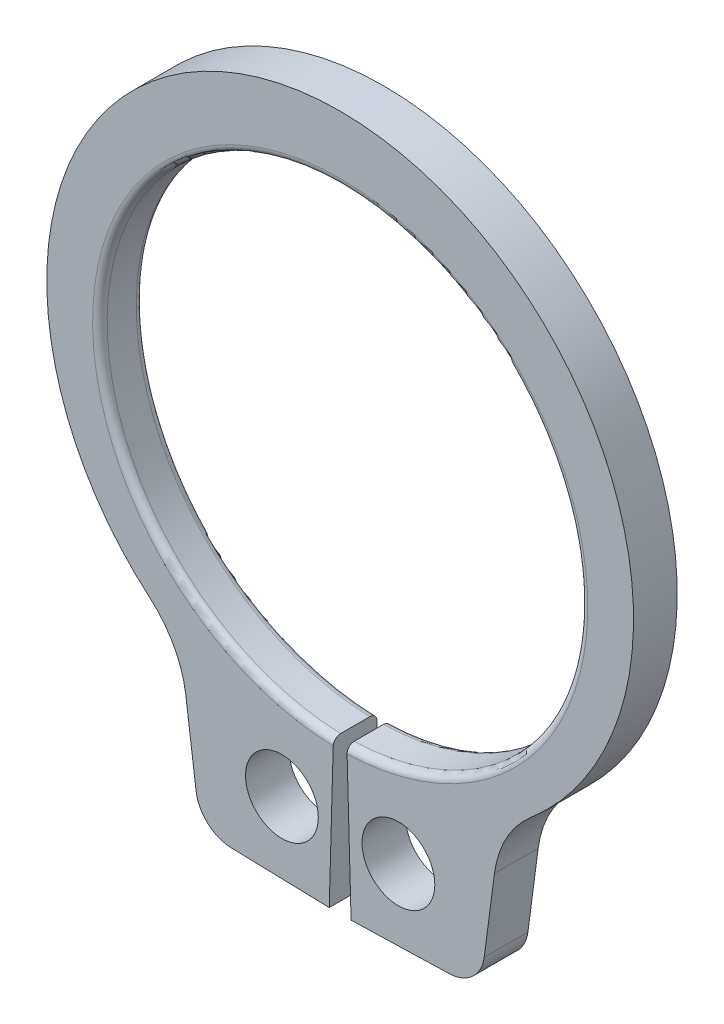
ISO-10303-21;
HEADER;
FILE_DESCRIPTION(('STEP AP214'),'2;1');
FILE_NAME('part.step','',(''),(''),'','','');
FILE_SCHEMA(('AUTOMOTIVE_DESIGN { 1 0 10303 214 1 1 1 1 }'));
ENDSEC;
DATA;
#1=APPLICATION_CONTEXT('core data for automotive mechanical design processes');
#2=APPLICATION_PROTOCOL_DEFINITION('international standard','automotive_design',2000,#1);
#3=PRODUCT_CONTEXT('',#1,'mechanical');
#4=PRODUCT('Part','Part','',(#3));
#5=PRODUCT_RELATED_PRODUCT_CATEGORY('part','',(#4));
#6=PRODUCT_DEFINITION_FORMATION('','',#4);
#7=PRODUCT_DEFINITION_CONTEXT('part definition',#1,'design');
#8=PRODUCT_DEFINITION('design','',#6,#7);
#9=PRODUCT_DEFINITION_SHAPE('','',#8);
#10=(LENGTH_UNIT() NAMED_UNIT(*) SI_UNIT(.MILLI.,.METRE.));
#11=(NAMED_UNIT(*) PLANE_ANGLE_UNIT() SI_UNIT($,.RADIAN.));
#12=(NAMED_UNIT(*) SI_UNIT($,.STERADIAN.) SOLID_ANGLE_UNIT());
#13=UNCERTAINTY_MEASURE_WITH_UNIT(LENGTH_MEASURE(1.E-05),#10,'distance_accuracy_value','');
#14=(GEOMETRIC_REPRESENTATION_CONTEXT(3) GLOBAL_UNCERTAINTY_ASSIGNED_CONTEXT((#13)) GLOBAL_UNIT_ASSIGNED_CONTEXT((#10,
#11,#12)) REPRESENTATION_CONTEXT('',''));
#15=CARTESIAN_POINT('',(0.,0.,0.));
#16=DIRECTION('',(0.,0.,1.));
#17=DIRECTION('',(1.,0.,0.));
#18=AXIS2_PLACEMENT_3D('',#15,#16,#17);
#19=CARTESIAN_POINT('',(-0.737282973034326,1.18870796081462,-0.413580684840872));
#20=DIRECTION('',(0.,0.,1.));
#21=DIRECTION('',(1.,0.,0.));
#22=AXIS2_PLACEMENT_3D('',#19,#20,#21);
#23=CYLINDRICAL_SURFACE('',#22,3.3);
#24=DIRECTION('',(0.,0.,1.));
#25=VECTOR('',#24,1.);
#26=CARTESIAN_POINT('',(-0.644759608548344,-2.10999472767129,-0.413580684840872));
#27=LINE('',#26,#25);
#28=CARTESIAN_POINT('',(-0.644759608548344,-2.10999472767129,-0.313580684840872));
#29=VERTEX_POINT('',#28);
#30=CARTESIAN_POINT('',(-0.644759608548344,-2.10999472767129,0.086419315159128));
#31=VERTEX_POINT('',#30);
#32=EDGE_CURVE('E161',#29,#31,#27,.T.);
#33=ORIENTED_EDGE('',*,*,#32,.T.);
#34=CARTESIAN_POINT('',(-0.737282973034326,1.18870796081462,0.086419315159128));
#35=DIRECTION('',(0.,0.,1.));
#36=DIRECTION('',(1.,0.,0.));
#37=AXIS2_PLACEMENT_3D('',#34,#35,#36);
#38=CIRCLE('',#37,3.3);
#39=CARTESIAN_POINT('',(-0.829806337520307,-2.10999472767129,0.086419315159128));
#40=VERTEX_POINT('',#39);
#41=EDGE_CURVE('E62',#31,#40,#38,.T.);
#42=ORIENTED_EDGE('',*,*,#41,.T.);
#43=DIRECTION('',(0.,0.,1.));
#44=VECTOR('',#43,1.);
#45=CARTESIAN_POINT('',(-0.829806337520307,-2.10999472767129,-0.413580684840872));
#46=LINE('',#45,#44);
#47=CARTESIAN_POINT('',(-0.829806337520307,-2.10999472767129,-0.313580684840872));
#48=VERTEX_POINT('',#47);
#49=EDGE_CURVE('E225',#48,#40,#46,.T.);
#50=ORIENTED_EDGE('',*,*,#49,.F.);
#51=CARTESIAN_POINT('',(-0.737282973034326,1.18870796081462,-0.313580684840872));
#52=DIRECTION('',(0.,0.,1.));
#53=DIRECTION('',(1.,0.,0.));
#54=AXIS2_PLACEMENT_3D('',#51,#52,#53);
#55=CIRCLE('',#54,3.3);
#56=EDGE_CURVE('E251',#48,#29,#55,.F.);
#57=ORIENTED_EDGE('',*,*,#56,.T.);
#58=EDGE_LOOP('',(#33,#42,#50,#57));
#59=FACE_BOUND('',#58,.T.);
#60=ADVANCED_FACE('F41',(#59),#23,.F.);
#61=CARTESIAN_POINT('',(-0.829806337520307,-2.10999472767129,-0.413580684840872));
#62=DIRECTION('',(0.999606875298762,-0.0280373831775701,0.));
#63=DIRECTION('',(0.0280373831775701,0.999606875298762,0.));
#64=AXIS2_PLACEMENT_3D('',#61,#62,#63);
#65=PLANE('',#64);
#66=ORIENTED_EDGE('',*,*,#49,.T.);
#67=CARTESIAN_POINT('',(-0.832610075838064,-2.20995541520117,0.086419315159128));
#68=DIRECTION('',(0.999606875298762,-0.0280373831775701,0.));
#69=DIRECTION('',(0.0280373831775701,0.999606875298762,0.));
#70=AXIS2_PLACEMENT_3D('',#67,#68,#69);
#71=CIRCLE('',#70,0.1);
#72=CARTESIAN_POINT('',(-0.832610075838064,-2.20995541520117,0.186419315159128));
#73=VERTEX_POINT('',#72);
#74=EDGE_CURVE('E49',#40,#73,#71,.T.);
#75=ORIENTED_EDGE('',*,*,#74,.T.);
#76=DIRECTION('',(0.0280373831775701,0.999606875298762,0.));
#77=VECTOR('',#76,1.);
#78=CARTESIAN_POINT('',(-0.829806337520307,-2.10999472767129,0.186419315159128));
#79=LINE('',#78,#77);
#80=CARTESIAN_POINT('',(-0.887282973034325,-4.15918882203375,0.186419315159128));
#81=VERTEX_POINT('',#80);
#82=EDGE_CURVE('E153',#81,#73,#79,.T.);
#83=ORIENTED_EDGE('',*,*,#82,.F.);
#84=DIRECTION('',(0.,0.,1.));
#85=VECTOR('',#84,1.);
#86=CARTESIAN_POINT('',(-0.887282973034325,-4.15918882203375,-0.413580684840872));
#87=LINE('',#86,#85);
#88=CARTESIAN_POINT('',(-0.887282973034325,-4.15918882203375,-0.413580684840872));
#89=VERTEX_POINT('',#88);
#90=EDGE_CURVE('E228',#89,#81,#87,.T.);
#91=ORIENTED_EDGE('',*,*,#90,.F.);
#92=DIRECTION('',(0.0280373831775701,0.999606875298762,0.));
#93=VECTOR('',#92,1.);
#94=CARTESIAN_POINT('',(-0.829806337520307,-2.10999472767129,-0.413580684840872));
#95=LINE('',#94,#93);
#96=CARTESIAN_POINT('',(-0.832610075838064,-2.20995541520117,-0.413580684840872));
#97=VERTEX_POINT('',#96);
#98=EDGE_CURVE('E193',#89,#97,#95,.T.);
#99=ORIENTED_EDGE('',*,*,#98,.T.);
#100=CARTESIAN_POINT('',(-0.832610075838064,-2.20995541520117,-0.313580684840872));
#101=DIRECTION('',(0.999606875298762,-0.0280373831775701,0.));
#102=DIRECTION('',(0.0280373831775701,0.999606875298762,0.));
#103=AXIS2_PLACEMENT_3D('',#100,#101,#102);
#104=CIRCLE('',#103,0.1);
#105=EDGE_CURVE('E255',#97,#48,#104,.T.);
#106=ORIENTED_EDGE('',*,*,#105,.T.);
#107=EDGE_LOOP('',(#66,#75,#83,#91,#99,#106));
#108=FACE_BOUND('',#107,.T.);
#109=ADVANCED_FACE('F259',(#108),#65,.T.);
#110=CARTESIAN_POINT('',(-0.887282973034325,-4.15918882203375,-0.413580684840872));
#111=DIRECTION('',(-0.0280373831775699,-0.999606875298762,0.));
#112=DIRECTION('',(0.999606875298762,-0.0280373831775699,0.));
#113=AXIS2_PLACEMENT_3D('',#110,#111,#112);
#114=PLANE('',#113);
#115=DIRECTION('',(0.999606875298762,-0.0280373831775699,0.));
#116=VECTOR('',#115,1.);
#117=CARTESIAN_POINT('',(-0.887282973034325,-4.15918882203375,0.186419315159128));
#118=LINE('',#117,#116);
#119=CARTESIAN_POINT('',(-2.23422534316447,-4.12140923059371,0.186419315159128));
#120=VERTEX_POINT('',#119);
#121=EDGE_CURVE('E220',#120,#81,#118,.T.);
#122=ORIENTED_EDGE('',*,*,#121,.F.);
#123=DIRECTION('',(0.,0.,1.));
#124=VECTOR('',#123,1.);
#125=CARTESIAN_POINT('',(-2.23422534316447,-4.12140923059371,-0.413580684840872));
#126=LINE('',#125,#124);
#127=CARTESIAN_POINT('',(-2.23422534316447,-4.12140923059371,-0.413580684840872));
#128=VERTEX_POINT('',#127);
#129=EDGE_CURVE('E230',#128,#120,#126,.T.);
#130=ORIENTED_EDGE('',*,*,#129,.F.);
#131=DIRECTION('',(0.999606875298762,-0.0280373831775699,0.));
#132=VECTOR('',#131,1.);
#133=CARTESIAN_POINT('',(-0.887282973034325,-4.15918882203375,-0.413580684840872));
#134=LINE('',#133,#132);
#135=EDGE_CURVE('E190',#128,#89,#134,.T.);
#136=ORIENTED_EDGE('',*,*,#135,.T.);
#137=ORIENTED_EDGE('',*,*,#90,.T.);
#138=EDGE_LOOP('',(#122,#130,#136,#137));
#139=FACE_BOUND('',#138,.T.);
#140=ADVANCED_FACE('F311',(#139),#114,.T.);
#141=CARTESIAN_POINT('',(-2.22020665157569,-3.62160579294433,-0.413580684840872));
#142=DIRECTION('',(0.,0.,1.));
#143=DIRECTION('',(1.,0.,0.));
#144=AXIS2_PLACEMENT_3D('',#141,#142,#143);
#145=CYLINDRICAL_SURFACE('',#144,0.500000000000001);
#146=CARTESIAN_POINT('',(-2.22020665157569,-3.62160579294433,0.186419315159128));
#147=DIRECTION('',(0.,0.,1.));
#148=DIRECTION('',(1.,0.,0.));
#149=AXIS2_PLACEMENT_3D('',#146,#147,#148);
#150=CIRCLE('',#149,0.500000000000001);
#151=CARTESIAN_POINT('',(-2.71592908226259,-3.68686888905436,0.186419315159128));
#152=VERTEX_POINT('',#151);
#153=EDGE_CURVE('E217',#152,#120,#150,.T.);
#154=ORIENTED_EDGE('',*,*,#153,.F.);
#155=DIRECTION('',(0.,0.,1.));
#156=VECTOR('',#155,1.);
#157=CARTESIAN_POINT('',(-2.71592908226259,-3.68686888905436,-0.413580684840872));
#158=LINE('',#157,#156);
#159=CARTESIAN_POINT('',(-2.71592908226259,-3.68686888905436,-0.413580684840872));
#160=VERTEX_POINT('',#159);
#161=EDGE_CURVE('E232',#160,#152,#158,.T.);
#162=ORIENTED_EDGE('',*,*,#161,.F.);
#163=CARTESIAN_POINT('',(-2.22020665157569,-3.62160579294433,-0.413580684840872));
#164=DIRECTION('',(0.,0.,1.));
#165=DIRECTION('',(1.,0.,0.));
#166=AXIS2_PLACEMENT_3D('',#163,#164,#165);
#167=CIRCLE('',#166,0.500000000000001);
#168=EDGE_CURVE('E187',#160,#128,#167,.T.);
#169=ORIENTED_EDGE('',*,*,#168,.T.);
#170=ORIENTED_EDGE('',*,*,#129,.T.);
#171=EDGE_LOOP('',(#154,#162,#169,#170));
#172=FACE_BOUND('',#171,.T.);
#173=ADVANCED_FACE('F275',(#172),#145,.T.);
#174=CARTESIAN_POINT('',(-2.85653309301859,-2.61887539608886,-0.413580684840872));
#175=DIRECTION('',(-0.99144486137381,-0.130526192220052,0.));
#176=DIRECTION('',(0.130526192220052,-0.99144486137381,0.));
#177=AXIS2_PLACEMENT_3D('',#174,#175,#176);
#178=PLANE('',#177);
#179=DIRECTION('',(0.130526192220052,-0.99144486137381,0.));
#180=VECTOR('',#179,1.);
#181=CARTESIAN_POINT('',(-2.85653309301859,-2.61887539608886,0.186419315159128));
#182=LINE('',#181,#180);
#183=CARTESIAN_POINT('',(-2.85653309301859,-2.61887539608886,0.186419315159128));
#184=VERTEX_POINT('',#183);
#185=EDGE_CURVE('E214',#184,#152,#182,.T.);
#186=ORIENTED_EDGE('',*,*,#185,.F.);
#187=DIRECTION('',(0.,0.,1.));
#188=VECTOR('',#187,1.);
#189=CARTESIAN_POINT('',(-2.85653309301859,-2.61887539608886,-0.413580684840872));
#190=LINE('',#189,#188);
#191=CARTESIAN_POINT('',(-2.85653309301859,-2.61887539608886,-0.413580684840872));
#192=VERTEX_POINT('',#191);
#193=EDGE_CURVE('E234',#192,#184,#190,.T.);
#194=ORIENTED_EDGE('',*,*,#193,.F.);
#195=DIRECTION('',(0.130526192220052,-0.99144486137381,0.));
#196=VECTOR('',#195,1.);
#197=CARTESIAN_POINT('',(-2.85653309301859,-2.61887539608886,-0.413580684840872));
#198=LINE('',#197,#196);
#199=EDGE_CURVE('E184',#192,#160,#198,.T.);
#200=ORIENTED_EDGE('',*,*,#199,.T.);
#201=ORIENTED_EDGE('',*,*,#161,.T.);
#202=EDGE_LOOP('',(#186,#194,#200,#201));
#203=FACE_BOUND('',#202,.T.);
#204=ADVANCED_FACE('F278',(#203),#178,.T.);
#205=CARTESIAN_POINT('',(-4.29370831193479,-2.80808310312989,-0.413580684840872));
#206=DIRECTION('',(0.,0.,1.));
#207=DIRECTION('',(1.,0.,0.));
#208=AXIS2_PLACEMENT_3D('',#205,#206,#207);
#209=CYLINDRICAL_SURFACE('',#208,1.449576547227);
#210=CARTESIAN_POINT('',(-4.29370831193479,-2.80808310312989,0.186419315159128));
#211=DIRECTION('',(0.,0.,-1.));
#212=DIRECTION('',(1.,0.,0.));
#213=AXIS2_PLACEMENT_3D('',#210,#211,#212);
#214=CIRCLE('',#213,1.449576547227);
#215=CARTESIAN_POINT('',(-3.35274795362747,-1.70542006740016,0.186419315159128));
#216=VERTEX_POINT('',#215);
#217=EDGE_CURVE('E211',#216,#184,#214,.T.);
#218=ORIENTED_EDGE('',*,*,#217,.F.);
#219=DIRECTION('',(0.,0.,1.));
#220=VECTOR('',#219,1.);
#221=CARTESIAN_POINT('',(-3.35274795362747,-1.70542006740016,-0.413580684840872));
#222=LINE('',#221,#220);
#223=CARTESIAN_POINT('',(-3.35274795362747,-1.70542006740016,-0.413580684840872));
#224=VERTEX_POINT('',#223);
#225=EDGE_CURVE('E236',#224,#216,#222,.T.);
#226=ORIENTED_EDGE('',*,*,#225,.F.);
#227=CARTESIAN_POINT('',(-4.29370831193479,-2.80808310312989,-0.413580684840872));
#228=DIRECTION('',(0.,0.,-1.));
#229=DIRECTION('',(1.,0.,0.));
#230=AXIS2_PLACEMENT_3D('',#227,#228,#229);
#231=CIRCLE('',#230,1.449576547227);
#232=EDGE_CURVE('E181',#224,#192,#231,.T.);
#233=ORIENTED_EDGE('',*,*,#232,.T.);
#234=ORIENTED_EDGE('',*,*,#193,.T.);
#235=EDGE_LOOP('',(#218,#226,#233,#234));
#236=FACE_BOUND('',#235,.T.);
#237=ADVANCED_FACE('F283',(#236),#209,.F.);
#238=CARTESIAN_POINT('',(-0.737282973034326,1.35950878946857,-0.413580684840872));
#239=DIRECTION('',(0.,0.,1.));
#240=DIRECTION('',(1.,0.,0.));
#241=AXIS2_PLACEMENT_3D('',#238,#239,#240);
#242=CYLINDRICAL_SURFACE('',#241,4.02919917134605);
#243=CARTESIAN_POINT('',(-0.737282973034326,1.35950878946857,0.186419315159128));
#244=DIRECTION('',(0.,0.,1.));
#245=DIRECTION('',(1.,0.,0.));
#246=AXIS2_PLACEMENT_3D('',#243,#244,#245);
#247=CIRCLE('',#246,4.02919917134605);
#248=CARTESIAN_POINT('',(1.87818200755882,-1.70542006740015,0.186419315159128));
#249=VERTEX_POINT('',#248);
#250=EDGE_CURVE('E208',#249,#216,#247,.T.);
#251=ORIENTED_EDGE('',*,*,#250,.F.);
#252=DIRECTION('',(0.,0.,1.));
#253=VECTOR('',#252,1.);
#254=CARTESIAN_POINT('',(1.87818200755882,-1.70542006740015,-0.413580684840872));
#255=LINE('',#254,#253);
#256=CARTESIAN_POINT('',(1.87818200755882,-1.70542006740015,-0.413580684840872));
#257=VERTEX_POINT('',#256);
#258=EDGE_CURVE('E238',#257,#249,#255,.T.);
#259=ORIENTED_EDGE('',*,*,#258,.F.);
#260=CARTESIAN_POINT('',(-0.737282973034326,1.35950878946857,-0.413580684840872));
#261=DIRECTION('',(0.,0.,1.));
#262=DIRECTION('',(1.,0.,0.));
#263=AXIS2_PLACEMENT_3D('',#260,#261,#262);
#264=CIRCLE('',#263,4.02919917134605);
#265=EDGE_CURVE('E178',#257,#224,#264,.T.);
#266=ORIENTED_EDGE('',*,*,#265,.T.);
#267=ORIENTED_EDGE('',*,*,#225,.T.);
#268=EDGE_LOOP('',(#251,#259,#266,#267));
#269=FACE_BOUND('',#268,.T.);
#270=ADVANCED_FACE('F286',(#269),#242,.T.);
#271=CARTESIAN_POINT('',(2.81914236586614,-2.80808310312989,-0.413580684840872));
#272=DIRECTION('',(0.,0.,1.));
#273=DIRECTION('',(1.,0.,0.));
#274=AXIS2_PLACEMENT_3D('',#271,#272,#273);
#275=CYLINDRICAL_SURFACE('',#274,1.449576547227);
#276=CARTESIAN_POINT('',(2.81914236586614,-2.80808310312989,0.186419315159128));
#277=DIRECTION('',(0.,0.,-1.));
#278=DIRECTION('',(1.,0.,0.));
#279=AXIS2_PLACEMENT_3D('',#276,#277,#278);
#280=CIRCLE('',#279,1.449576547227);
#281=CARTESIAN_POINT('',(1.38196714694994,-2.61887539608886,0.186419315159128));
#282=VERTEX_POINT('',#281);
#283=EDGE_CURVE('E205',#282,#249,#280,.T.);
#284=ORIENTED_EDGE('',*,*,#283,.F.);
#285=DIRECTION('',(0.,0.,1.));
#286=VECTOR('',#285,1.);
#287=CARTESIAN_POINT('',(1.38196714694994,-2.61887539608886,-0.413580684840872));
#288=LINE('',#287,#286);
#289=CARTESIAN_POINT('',(1.38196714694994,-2.61887539608886,-0.413580684840872));
#290=VERTEX_POINT('',#289);
#291=EDGE_CURVE('E240',#290,#282,#288,.T.);
#292=ORIENTED_EDGE('',*,*,#291,.F.);
#293=CARTESIAN_POINT('',(2.81914236586614,-2.80808310312989,-0.413580684840872));
#294=DIRECTION('',(0.,0.,-1.));
#295=DIRECTION('',(1.,0.,0.));
#296=AXIS2_PLACEMENT_3D('',#293,#294,#295);
#297=CIRCLE('',#296,1.449576547227);
#298=EDGE_CURVE('E175',#290,#257,#297,.T.);
#299=ORIENTED_EDGE('',*,*,#298,.T.);
#300=ORIENTED_EDGE('',*,*,#258,.T.);
#301=EDGE_LOOP('',(#284,#292,#299,#300));
#302=FACE_BOUND('',#301,.T.);
#303=ADVANCED_FACE('F290',(#302),#275,.F.);
#304=CARTESIAN_POINT('',(1.38196714694994,-2.61887539608886,-0.413580684840872));
#305=DIRECTION('',(0.99144486137381,-0.130526192220052,0.));
#306=DIRECTION('',(0.130526192220052,0.99144486137381,0.));
#307=AXIS2_PLACEMENT_3D('',#304,#305,#306);
#308=PLANE('',#307);
#309=DIRECTION('',(0.130526192220052,0.99144486137381,0.));
#310=VECTOR('',#309,1.);
#311=CARTESIAN_POINT('',(1.38196714694994,-2.61887539608886,0.186419315159128));
#312=LINE('',#311,#310);
#313=CARTESIAN_POINT('',(1.24136313619394,-3.68686888905436,0.186419315159128));
#314=VERTEX_POINT('',#313);
#315=EDGE_CURVE('E202',#314,#282,#312,.T.);
#316=ORIENTED_EDGE('',*,*,#315,.F.);
#317=DIRECTION('',(0.,0.,1.));
#318=VECTOR('',#317,1.);
#319=CARTESIAN_POINT('',(1.24136313619394,-3.68686888905436,-0.413580684840872));
#320=LINE('',#319,#318);
#321=CARTESIAN_POINT('',(1.24136313619394,-3.68686888905436,-0.413580684840872));
#322=VERTEX_POINT('',#321);
#323=EDGE_CURVE('E242',#322,#314,#320,.T.);
#324=ORIENTED_EDGE('',*,*,#323,.F.);
#325=DIRECTION('',(0.130526192220052,0.99144486137381,0.));
#326=VECTOR('',#325,1.);
#327=CARTESIAN_POINT('',(1.38196714694994,-2.61887539608886,-0.413580684840872));
#328=LINE('',#327,#326);
#329=EDGE_CURVE('E169',#322,#290,#328,.T.);
#330=ORIENTED_EDGE('',*,*,#329,.T.);
#331=ORIENTED_EDGE('',*,*,#291,.T.);
#332=EDGE_LOOP('',(#316,#324,#330,#331));
#333=FACE_BOUND('',#332,.T.);
#334=ADVANCED_FACE('F293',(#333),#308,.T.);
#335=CARTESIAN_POINT('',(0.745640705507038,-3.62160579294433,-0.413580684840872));
#336=DIRECTION('',(0.,0.,1.));
#337=DIRECTION('',(1.,0.,0.));
#338=AXIS2_PLACEMENT_3D('',#335,#336,#337);
#339=CYLINDRICAL_SURFACE('',#338,0.500000000000001);
#340=CARTESIAN_POINT('',(0.745640705507038,-3.62160579294433,0.186419315159128));
#341=DIRECTION('',(0.,0.,1.));
#342=DIRECTION('',(-1.,0.,0.));
#343=AXIS2_PLACEMENT_3D('',#340,#341,#342);
#344=CIRCLE('',#343,0.500000000000001);
#345=CARTESIAN_POINT('',(0.759659397095823,-4.12140923059371,0.186419315159128));
#346=VERTEX_POINT('',#345);
#347=EDGE_CURVE('E199',#346,#314,#344,.T.);
#348=ORIENTED_EDGE('',*,*,#347,.F.);
#349=DIRECTION('',(0.,0.,1.));
#350=VECTOR('',#349,1.);
#351=CARTESIAN_POINT('',(0.759659397095823,-4.12140923059371,-0.413580684840872));
#352=LINE('',#351,#350);
#353=CARTESIAN_POINT('',(0.759659397095823,-4.12140923059371,-0.413580684840872));
#354=VERTEX_POINT('',#353);
#355=EDGE_CURVE('E160',#354,#346,#352,.T.);
#356=ORIENTED_EDGE('',*,*,#355,.F.);
#357=CARTESIAN_POINT('',(0.745640705507038,-3.62160579294433,-0.413580684840872));
#358=DIRECTION('',(0.,0.,1.));
#359=DIRECTION('',(-1.,0.,0.));
#360=AXIS2_PLACEMENT_3D('',#357,#358,#359);
#361=CIRCLE('',#360,0.500000000000001);
#362=EDGE_CURVE('E167',#354,#322,#361,.T.);
#363=ORIENTED_EDGE('',*,*,#362,.T.);
#364=ORIENTED_EDGE('',*,*,#323,.T.);
#365=EDGE_LOOP('',(#348,#356,#363,#364));
#366=FACE_BOUND('',#365,.T.);
#367=ADVANCED_FACE('F296',(#366),#339,.T.);
#368=CARTESIAN_POINT('',(-0.587282973034326,-4.15918882203375,-0.413580684840872));
#369=DIRECTION('',(0.0280373831775699,-0.999606875298762,0.));
#370=DIRECTION('',(0.999606875298762,0.0280373831775699,0.));
#371=AXIS2_PLACEMENT_3D('',#368,#369,#370);
#372=PLANE('',#371);
#373=DIRECTION('',(0.999606875298762,0.0280373831775699,0.));
#374=VECTOR('',#373,1.);
#375=CARTESIAN_POINT('',(-0.587282973034326,-4.15918882203375,0.186419315159128));
#376=LINE('',#375,#374);
#377=CARTESIAN_POINT('',(-0.587282973034326,-4.15918882203375,0.186419315159128));
#378=VERTEX_POINT('',#377);
#379=EDGE_CURVE('E159',#378,#346,#376,.T.);
#380=ORIENTED_EDGE('',*,*,#379,.F.);
#381=DIRECTION('',(0.,0.,1.));
#382=VECTOR('',#381,1.);
#383=CARTESIAN_POINT('',(-0.587282973034326,-4.15918882203375,-0.413580684840872));
#384=LINE('',#383,#382);
#385=CARTESIAN_POINT('',(-0.587282973034326,-4.15918882203375,-0.413580684840872));
#386=VERTEX_POINT('',#385);
#387=EDGE_CURVE('E147',#386,#378,#384,.T.);
#388=ORIENTED_EDGE('',*,*,#387,.F.);
#389=DIRECTION('',(0.999606875298762,0.0280373831775699,0.));
#390=VECTOR('',#389,1.);
#391=CARTESIAN_POINT('',(-0.587282973034326,-4.15918882203375,-0.413580684840872));
#392=LINE('',#391,#390);
#393=EDGE_CURVE('E152',#386,#354,#392,.T.);
#394=ORIENTED_EDGE('',*,*,#393,.T.);
#395=ORIENTED_EDGE('',*,*,#355,.T.);
#396=EDGE_LOOP('',(#380,#388,#394,#395));
#397=FACE_BOUND('',#396,.T.);
#398=ADVANCED_FACE('F157',(#397),#372,.T.);
#399=CARTESIAN_POINT('',(-0.644759608548344,-2.10999472767129,-0.413580684840872));
#400=DIRECTION('',(-0.999606875298762,-0.0280373831775701,0.));
#401=DIRECTION('',(0.0280373831775701,-0.999606875298762,0.));
#402=AXIS2_PLACEMENT_3D('',#399,#400,#401);
#403=PLANE('',#402);
#404=DIRECTION('',(0.0280373831775701,-0.999606875298762,0.));
#405=VECTOR('',#404,1.);
#406=CARTESIAN_POINT('',(-0.644759608548344,-2.10999472767129,0.186419315159128));
#407=LINE('',#406,#405);
#408=CARTESIAN_POINT('',(-0.641955870230587,-2.20995541520117,0.186419315159128));
#409=VERTEX_POINT('',#408);
#410=EDGE_CURVE('E195',#409,#378,#407,.T.);
#411=ORIENTED_EDGE('',*,*,#410,.F.);
#412=CARTESIAN_POINT('',(-0.641955870230587,-2.20995541520117,0.086419315159128));
#413=DIRECTION('',(-0.999606875298762,-0.0280373831775701,0.));
#414=DIRECTION('',(0.0280373831775701,-0.999606875298762,0.));
#415=AXIS2_PLACEMENT_3D('',#412,#413,#414);
#416=CIRCLE('',#415,0.1);
#417=EDGE_CURVE('E249',#409,#31,#416,.T.);
#418=ORIENTED_EDGE('',*,*,#417,.T.);
#419=ORIENTED_EDGE('',*,*,#32,.F.);
#420=CARTESIAN_POINT('',(-0.641955870230587,-2.20995541520117,-0.313580684840872));
#421=DIRECTION('',(-0.999606875298762,-0.0280373831775701,0.));
#422=DIRECTION('',(0.0280373831775701,-0.999606875298762,0.));
#423=AXIS2_PLACEMENT_3D('',#420,#421,#422);
#424=CIRCLE('',#423,0.1);
#425=CARTESIAN_POINT('',(-0.641955870230587,-2.20995541520117,-0.413580684840872));
#426=VERTEX_POINT('',#425);
#427=EDGE_CURVE('E150',#29,#426,#424,.T.);
#428=ORIENTED_EDGE('',*,*,#427,.T.);
#429=DIRECTION('',(0.0280373831775701,-0.999606875298762,0.));
#430=VECTOR('',#429,1.);
#431=CARTESIAN_POINT('',(-0.644759608548344,-2.10999472767129,-0.413580684840872));
#432=LINE('',#431,#430);
#433=EDGE_CURVE('E143',#426,#386,#432,.T.);
#434=ORIENTED_EDGE('',*,*,#433,.T.);
#435=ORIENTED_EDGE('',*,*,#387,.T.);
#436=EDGE_LOOP('',(#411,#418,#419,#428,#434,#435));
#437=FACE_BOUND('',#436,.T.);
#438=ADVANCED_FACE('F146',(#437),#403,.T.);
#439=CARTESIAN_POINT('',(-0.737282973034326,1.18870796081462,-0.413580684840872));
#440=DIRECTION('',(0.,0.,1.));
#441=DIRECTION('',(1.,0.,0.));
#442=AXIS2_PLACEMENT_3D('',#439,#440,#441);
#443=PLANE('',#442);
#444=CARTESIAN_POINT('',(-1.53728297303433,-3.16337487387499,-0.413580684840872));
#445=DIRECTION('',(0.,0.,1.));
#446=DIRECTION('',(1.,0.,0.));
#447=AXIS2_PLACEMENT_3D('',#444,#445,#446);
#448=CIRCLE('',#447,0.5);
#449=CARTESIAN_POINT('',(-1.03728297303433,-3.16337487387499,-0.413580684840872));
#450=VERTEX_POINT('',#449);
#451=EDGE_CURVE('E456',#450,#450,#448,.T.);
#452=ORIENTED_EDGE('',*,*,#451,.T.);
#453=EDGE_LOOP('',(#452));
#454=FACE_BOUND('',#453,.T.);
#455=CARTESIAN_POINT('',(0.0627170269656745,-3.16337487387499,-0.413580684840872));
#456=DIRECTION('',(0.,0.,1.));
#457=DIRECTION('',(1.,0.,0.));
#458=AXIS2_PLACEMENT_3D('',#455,#456,#457);
#459=CIRCLE('',#458,0.5);
#460=CARTESIAN_POINT('',(0.562717026965675,-3.16337487387499,-0.413580684840872));
#461=VERTEX_POINT('',#460);
#462=EDGE_CURVE('E197',#461,#461,#459,.T.);
#463=ORIENTED_EDGE('',*,*,#462,.T.);
#464=EDGE_LOOP('',(#463));
#465=FACE_BOUND('',#464,.T.);
#466=ORIENTED_EDGE('',*,*,#433,.F.);
#467=CARTESIAN_POINT('',(-0.737282973034326,1.18870796081462,-0.413580684840872));
#468=DIRECTION('',(0.,0.,1.));
#469=DIRECTION('',(1.,0.,0.));
#470=AXIS2_PLACEMENT_3D('',#467,#468,#469);
#471=CIRCLE('',#470,3.4);
#472=EDGE_CURVE('E11',#426,#97,#471,.T.);
#473=ORIENTED_EDGE('',*,*,#472,.T.);
#474=ORIENTED_EDGE('',*,*,#98,.F.);
#475=ORIENTED_EDGE('',*,*,#135,.F.);
#476=ORIENTED_EDGE('',*,*,#168,.F.);
#477=ORIENTED_EDGE('',*,*,#199,.F.);
#478=ORIENTED_EDGE('',*,*,#232,.F.);
#479=ORIENTED_EDGE('',*,*,#265,.F.);
#480=ORIENTED_EDGE('',*,*,#298,.F.);
#481=ORIENTED_EDGE('',*,*,#329,.F.);
#482=ORIENTED_EDGE('',*,*,#362,.F.);
#483=ORIENTED_EDGE('',*,*,#393,.F.);
#484=EDGE_LOOP('',(#466,#473,#474,#475,#476,#477,#478,#479,#480,#481,#482,#483));
#485=FACE_BOUND('',#484,.T.);
#486=ADVANCED_FACE('F164',(#454,#465,#485),#443,.F.);
#487=CARTESIAN_POINT('',(-0.737282973034326,1.18870796081462,0.186419315159128));
#488=DIRECTION('',(0.,0.,1.));
#489=DIRECTION('',(1.,0.,0.));
#490=AXIS2_PLACEMENT_3D('',#487,#488,#489);
#491=PLANE('',#490);
#492=CARTESIAN_POINT('',(-1.53728297303433,-3.16337487387499,0.186419315159128));
#493=DIRECTION('',(0.,0.,1.));
#494=DIRECTION('',(1.,0.,0.));
#495=AXIS2_PLACEMENT_3D('',#492,#493,#494);
#496=CIRCLE('',#495,0.5);
#497=CARTESIAN_POINT('',(-1.03728297303433,-3.16337487387499,0.186419315159128));
#498=VERTEX_POINT('',#497);
#499=EDGE_CURVE('E451',#498,#498,#496,.T.);
#500=ORIENTED_EDGE('',*,*,#499,.F.);
#501=EDGE_LOOP('',(#500));
#502=FACE_BOUND('',#501,.T.);
#503=CARTESIAN_POINT('',(0.0627170269656745,-3.16337487387499,0.186419315159128));
#504=DIRECTION('',(0.,0.,1.));
#505=DIRECTION('',(1.,0.,0.));
#506=AXIS2_PLACEMENT_3D('',#503,#504,#505);
#507=CIRCLE('',#506,0.5);
#508=CARTESIAN_POINT('',(0.562717026965675,-3.16337487387499,0.186419315159128));
#509=VERTEX_POINT('',#508);
#510=EDGE_CURVE('E454',#509,#509,#507,.T.);
#511=ORIENTED_EDGE('',*,*,#510,.F.);
#512=EDGE_LOOP('',(#511));
#513=FACE_BOUND('',#512,.T.);
#514=ORIENTED_EDGE('',*,*,#82,.T.);
#515=CARTESIAN_POINT('',(-0.737282973034326,1.18870796081462,0.186419315159128));
#516=DIRECTION('',(0.,0.,1.));
#517=DIRECTION('',(1.,0.,0.));
#518=AXIS2_PLACEMENT_3D('',#515,#516,#517);
#519=CIRCLE('',#518,3.4);
#520=EDGE_CURVE('E227',#73,#409,#519,.F.);
#521=ORIENTED_EDGE('',*,*,#520,.T.);
#522=ORIENTED_EDGE('',*,*,#410,.T.);
#523=ORIENTED_EDGE('',*,*,#379,.T.);
#524=ORIENTED_EDGE('',*,*,#347,.T.);
#525=ORIENTED_EDGE('',*,*,#315,.T.);
#526=ORIENTED_EDGE('',*,*,#283,.T.);
#527=ORIENTED_EDGE('',*,*,#250,.T.);
#528=ORIENTED_EDGE('',*,*,#217,.T.);
#529=ORIENTED_EDGE('',*,*,#185,.T.);
#530=ORIENTED_EDGE('',*,*,#153,.T.);
#531=ORIENTED_EDGE('',*,*,#121,.T.);
#532=EDGE_LOOP('',(#514,#521,#522,#523,#524,#525,#526,#527,#528,#529,#530,#531));
#533=FACE_BOUND('',#532,.T.);
#534=ADVANCED_FACE('F263',(#502,#513,#533),#491,.T.);
#535=CARTESIAN_POINT('',(0.0627170269656745,-3.16337487387499,-0.413580684840872));
#536=DIRECTION('',(0.,0.,1.));
#537=DIRECTION('',(1.,0.,0.));
#538=AXIS2_PLACEMENT_3D('',#535,#536,#537);
#539=CYLINDRICAL_SURFACE('',#538,0.5);
#540=ORIENTED_EDGE('',*,*,#462,.F.);
#541=EDGE_LOOP('',(#540));
#542=FACE_BOUND('',#541,.T.);
#543=ORIENTED_EDGE('',*,*,#510,.T.);
#544=EDGE_LOOP('',(#543));
#545=FACE_BOUND('',#544,.T.);
#546=ADVANCED_FACE('F321',(#542,#545),#539,.F.);
#547=CARTESIAN_POINT('',(-1.53728297303433,-3.16337487387499,-0.413580684840872));
#548=DIRECTION('',(0.,0.,1.));
#549=DIRECTION('',(1.,0.,0.));
#550=AXIS2_PLACEMENT_3D('',#547,#548,#549);
#551=CYLINDRICAL_SURFACE('',#550,0.5);
#552=ORIENTED_EDGE('',*,*,#451,.F.);
#553=EDGE_LOOP('',(#552));
#554=FACE_BOUND('',#553,.T.);
#555=ORIENTED_EDGE('',*,*,#499,.T.);
#556=EDGE_LOOP('',(#555));
#557=FACE_BOUND('',#556,.T.);
#558=ADVANCED_FACE('F315',(#554,#557),#551,.F.);
#559=CARTESIAN_POINT('',(-0.737282973034326,1.18870796081462,0.086419315159128));
#560=DIRECTION('',(0.,0.,1.));
#561=DIRECTION('',(1.,0.,0.));
#562=AXIS2_PLACEMENT_3D('',#559,#560,#561);
#563=TOROIDAL_SURFACE('',#562,3.4,0.1);
#564=ORIENTED_EDGE('',*,*,#74,.F.);
#565=ORIENTED_EDGE('',*,*,#41,.F.);
#566=ORIENTED_EDGE('',*,*,#417,.F.);
#567=ORIENTED_EDGE('',*,*,#520,.F.);
#568=EDGE_LOOP('',(#564,#565,#566,#567));
#569=FACE_BOUND('',#568,.T.);
#570=ADVANCED_FACE('F265',(#569),#563,.T.);
#571=CARTESIAN_POINT('',(-0.737282973034326,1.18870796081462,-0.313580684840872));
#572=DIRECTION('',(0.,0.,1.));
#573=DIRECTION('',(1.,0.,0.));
#574=AXIS2_PLACEMENT_3D('',#571,#572,#573);
#575=TOROIDAL_SURFACE('',#574,3.4,0.1);
#576=ORIENTED_EDGE('',*,*,#105,.F.);
#577=ORIENTED_EDGE('',*,*,#472,.F.);
#578=ORIENTED_EDGE('',*,*,#427,.F.);
#579=ORIENTED_EDGE('',*,*,#56,.F.);
#580=EDGE_LOOP('',(#576,#577,#578,#579));
#581=FACE_BOUND('',#580,.T.);
#582=ADVANCED_FACE('F43',(#581),#575,.T.);
#583=CLOSED_SHELL('',(#60,#109,#140,#173,#204,#237,#270,#303,#334,#367,#398,#438,#486,#534,#546,
#558,#570,#582));
#584=MANIFOLD_SOLID_BREP('B2',#583);
#585=ADVANCED_BREP_SHAPE_REPRESENTATION('',(#18,#584),#14);
#586=SHAPE_DEFINITION_REPRESENTATION(#9,#585);
ENDSEC;
END-ISO-10303-21;
